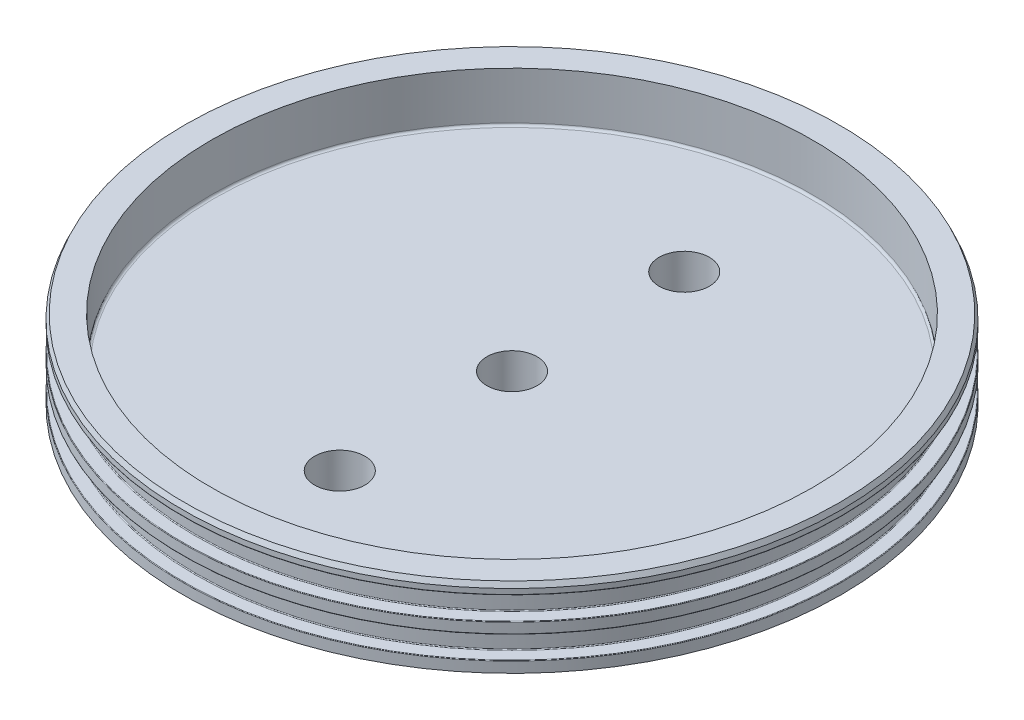
ISO-10303-21;
HEADER;
FILE_DESCRIPTION(('STEP AP214'),'2;1');
FILE_NAME('part.step','',(''),(''),'','','');
FILE_SCHEMA(('AUTOMOTIVE_DESIGN { 1 0 10303 214 1 1 1 1 }'));
ENDSEC;
DATA;
#1=APPLICATION_CONTEXT('core data for automotive mechanical design processes');
#2=APPLICATION_PROTOCOL_DEFINITION('international standard','automotive_design',2000,#1);
#3=PRODUCT_CONTEXT('',#1,'mechanical');
#4=PRODUCT('Part','Part','',(#3));
#5=PRODUCT_RELATED_PRODUCT_CATEGORY('part','',(#4));
#6=PRODUCT_DEFINITION_FORMATION('','',#4);
#7=PRODUCT_DEFINITION_CONTEXT('part definition',#1,'design');
#8=PRODUCT_DEFINITION('design','',#6,#7);
#9=PRODUCT_DEFINITION_SHAPE('','',#8);
#10=(LENGTH_UNIT() NAMED_UNIT(*) SI_UNIT(.MILLI.,.METRE.));
#11=(NAMED_UNIT(*) PLANE_ANGLE_UNIT() SI_UNIT($,.RADIAN.));
#12=(NAMED_UNIT(*) SI_UNIT($,.STERADIAN.) SOLID_ANGLE_UNIT());
#13=UNCERTAINTY_MEASURE_WITH_UNIT(LENGTH_MEASURE(1.E-05),#10,'distance_accuracy_value','');
#14=(GEOMETRIC_REPRESENTATION_CONTEXT(3) GLOBAL_UNCERTAINTY_ASSIGNED_CONTEXT((#13)) GLOBAL_UNIT_ASSIGNED_CONTEXT((#10,
#11,#12)) REPRESENTATION_CONTEXT('',''));
#15=CARTESIAN_POINT('',(0.,0.,0.));
#16=DIRECTION('',(0.,0.,1.));
#17=DIRECTION('',(1.,0.,0.));
#18=AXIS2_PLACEMENT_3D('',#15,#16,#17);
#19=CARTESIAN_POINT('',(0.,0.,0.));
#20=DIRECTION('',(0.,1.,0.));
#21=DIRECTION('',(-1.,0.,0.));
#22=AXIS2_PLACEMENT_3D('',#19,#20,#21);
#23=PLANE('',#22);
#24=CARTESIAN_POINT('',(0.,0.,0.));
#25=DIRECTION('',(0.,1.,0.));
#26=DIRECTION('',(-1.,0.,0.));
#27=AXIS2_PLACEMENT_3D('',#24,#25,#26);
#28=CIRCLE('',#27,66.2178);
#29=CARTESIAN_POINT('',(-66.2178,0.,0.));
#30=VERTEX_POINT('',#29);
#31=EDGE_CURVE('E113',#30,#30,#28,.T.);
#32=ORIENTED_EDGE('',*,*,#31,.T.);
#33=EDGE_LOOP('',(#32));
#34=FACE_BOUND('',#33,.T.);
#35=CARTESIAN_POINT('',(0.,0.,0.));
#36=DIRECTION('',(0.,1.,0.));
#37=DIRECTION('',(-1.,0.,0.));
#38=AXIS2_PLACEMENT_3D('',#35,#36,#37);
#39=CIRCLE('',#38,72.898);
#40=CARTESIAN_POINT('',(-72.898,0.,0.));
#41=VERTEX_POINT('',#40);
#42=EDGE_CURVE('E119',#41,#41,#39,.T.);
#43=ORIENTED_EDGE('',*,*,#42,.F.);
#44=EDGE_LOOP('',(#43));
#45=FACE_BOUND('',#44,.T.);
#46=ADVANCED_FACE('F39',(#34,#45),#23,.F.);
#47=CARTESIAN_POINT('',(0.,48.1922132313012,0.));
#48=DIRECTION('',(0.,1.,0.));
#49=DIRECTION('',(-1.,0.,0.));
#50=AXIS2_PLACEMENT_3D('',#47,#48,#49);
#51=CYLINDRICAL_SURFACE('',#50,72.898);
#52=CARTESIAN_POINT('',(0.,2.33679999999999,0.));
#53=DIRECTION('',(0.,-1.,0.));
#54=DIRECTION('',(1.,0.,0.));
#55=AXIS2_PLACEMENT_3D('',#52,#53,#54);
#56=CIRCLE('',#55,72.898);
#57=CARTESIAN_POINT('',(72.898,2.3368,0.));
#58=VERTEX_POINT('',#57);
#59=EDGE_CURVE('E59',#58,#58,#56,.T.);
#60=ORIENTED_EDGE('',*,*,#59,.T.);
#61=EDGE_LOOP('',(#60));
#62=FACE_BOUND('',#61,.T.);
#63=ORIENTED_EDGE('',*,*,#42,.T.);
#64=EDGE_LOOP('',(#63));
#65=FACE_BOUND('',#64,.T.);
#66=ADVANCED_FACE('F181',(#62,#65),#51,.T.);
#67=CARTESIAN_POINT('',(72.898,2.4638,0.));
#68=DIRECTION('',(0.,-1.,0.));
#69=DIRECTION('',(1.,0.,0.));
#70=AXIS2_PLACEMENT_3D('',#67,#68,#69);
#71=PLANE('',#70);
#72=CARTESIAN_POINT('',(0.,2.46379999999999,0.));
#73=DIRECTION('',(0.,-1.,0.));
#74=DIRECTION('',(1.,0.,0.));
#75=AXIS2_PLACEMENT_3D('',#72,#73,#74);
#76=CIRCLE('',#75,72.771);
#77=CARTESIAN_POINT('',(72.771,2.4638,0.));
#78=VERTEX_POINT('',#77);
#79=EDGE_CURVE('E62',#78,#78,#76,.F.);
#80=ORIENTED_EDGE('',*,*,#79,.T.);
#81=EDGE_LOOP('',(#80));
#82=FACE_BOUND('',#81,.T.);
#83=CARTESIAN_POINT('',(0.,2.46379999999999,0.));
#84=DIRECTION('',(0.,-1.,0.));
#85=DIRECTION('',(1.,0.,0.));
#86=AXIS2_PLACEMENT_3D('',#83,#84,#85);
#87=CIRCLE('',#86,70.1548);
#88=CARTESIAN_POINT('',(70.1548,2.4638,0.));
#89=VERTEX_POINT('',#88);
#90=EDGE_CURVE('E89',#89,#89,#87,.T.);
#91=ORIENTED_EDGE('',*,*,#90,.T.);
#92=EDGE_LOOP('',(#91));
#93=FACE_BOUND('',#92,.T.);
#94=ADVANCED_FACE('F188',(#82,#93),#71,.F.);
#95=CARTESIAN_POINT('',(0.,48.1922132313012,0.));
#96=DIRECTION('',(0.,1.,0.));
#97=DIRECTION('',(-1.,0.,0.));
#98=AXIS2_PLACEMENT_3D('',#95,#96,#97);
#99=CYLINDRICAL_SURFACE('',#98,69.977);
#100=CARTESIAN_POINT('',(0.,7.26439999999999,0.));
#101=DIRECTION('',(0.,1.,0.));
#102=DIRECTION('',(-1.,0.,0.));
#103=AXIS2_PLACEMENT_3D('',#100,#101,#102);
#104=CIRCLE('',#103,69.977);
#105=CARTESIAN_POINT('',(-69.977,7.26439999999998,0.));
#106=VERTEX_POINT('',#105);
#107=EDGE_CURVE('E92',#106,#106,#104,.F.);
#108=ORIENTED_EDGE('',*,*,#107,.T.);
#109=EDGE_LOOP('',(#108));
#110=FACE_BOUND('',#109,.T.);
#111=CARTESIAN_POINT('',(0.,2.64159999999999,0.));
#112=DIRECTION('',(0.,-1.,0.));
#113=DIRECTION('',(1.,0.,0.));
#114=AXIS2_PLACEMENT_3D('',#111,#112,#113);
#115=CIRCLE('',#114,69.977);
#116=CARTESIAN_POINT('',(69.977,2.6416,0.));
#117=VERTEX_POINT('',#116);
#118=EDGE_CURVE('E95',#117,#117,#115,.F.);
#119=ORIENTED_EDGE('',*,*,#118,.T.);
#120=EDGE_LOOP('',(#119));
#121=FACE_BOUND('',#120,.T.);
#122=ADVANCED_FACE('F278',(#110,#121),#99,.T.);
#123=CARTESIAN_POINT('',(69.977,7.4422,0.));
#124=DIRECTION('',(0.,1.,0.));
#125=DIRECTION('',(-1.,0.,0.));
#126=AXIS2_PLACEMENT_3D('',#123,#124,#125);
#127=PLANE('',#126);
#128=CARTESIAN_POINT('',(0.,7.44219999999999,0.));
#129=DIRECTION('',(0.,1.,0.));
#130=DIRECTION('',(-1.,0.,0.));
#131=AXIS2_PLACEMENT_3D('',#128,#129,#130);
#132=CIRCLE('',#131,72.771);
#133=CARTESIAN_POINT('',(-72.771,7.44219999999998,0.));
#134=VERTEX_POINT('',#133);
#135=EDGE_CURVE('E65',#134,#134,#132,.F.);
#136=ORIENTED_EDGE('',*,*,#135,.T.);
#137=EDGE_LOOP('',(#136));
#138=FACE_BOUND('',#137,.T.);
#139=CARTESIAN_POINT('',(0.,7.44219999999999,0.));
#140=DIRECTION('',(0.,1.,0.));
#141=DIRECTION('',(-1.,0.,0.));
#142=AXIS2_PLACEMENT_3D('',#139,#140,#141);
#143=CIRCLE('',#142,70.1548);
#144=CARTESIAN_POINT('',(-70.1548,7.44219999999998,0.));
#145=VERTEX_POINT('',#144);
#146=EDGE_CURVE('E98',#145,#145,#143,.T.);
#147=ORIENTED_EDGE('',*,*,#146,.T.);
#148=EDGE_LOOP('',(#147));
#149=FACE_BOUND('',#148,.T.);
#150=ADVANCED_FACE('F274',(#138,#149),#127,.F.);
#151=CARTESIAN_POINT('',(0.,48.1922132313012,0.));
#152=DIRECTION('',(0.,1.,0.));
#153=DIRECTION('',(-1.,0.,0.));
#154=AXIS2_PLACEMENT_3D('',#151,#152,#153);
#155=CYLINDRICAL_SURFACE('',#154,72.898);
#156=CARTESIAN_POINT('',(0.,9.77899999999999,0.));
#157=DIRECTION('',(0.,-1.,0.));
#158=DIRECTION('',(1.,0.,0.));
#159=AXIS2_PLACEMENT_3D('',#156,#157,#158);
#160=CIRCLE('',#159,72.898);
#161=CARTESIAN_POINT('',(72.898,9.779,0.));
#162=VERTEX_POINT('',#161);
#163=EDGE_CURVE('E68',#162,#162,#160,.T.);
#164=ORIENTED_EDGE('',*,*,#163,.T.);
#165=EDGE_LOOP('',(#164));
#166=FACE_BOUND('',#165,.T.);
#167=CARTESIAN_POINT('',(0.,7.56919999999999,0.));
#168=DIRECTION('',(0.,1.,0.));
#169=DIRECTION('',(-1.,0.,0.));
#170=AXIS2_PLACEMENT_3D('',#167,#168,#169);
#171=CIRCLE('',#170,72.898);
#172=CARTESIAN_POINT('',(-72.898,7.56919999999998,0.));
#173=VERTEX_POINT('',#172);
#174=EDGE_CURVE('E71',#173,#173,#171,.T.);
#175=ORIENTED_EDGE('',*,*,#174,.T.);
#176=EDGE_LOOP('',(#175));
#177=FACE_BOUND('',#176,.T.);
#178=ADVANCED_FACE('F270',(#166,#177),#155,.T.);
#179=CARTESIAN_POINT('',(72.898,9.906,0.));
#180=DIRECTION('',(0.,-1.,0.));
#181=DIRECTION('',(1.,0.,0.));
#182=AXIS2_PLACEMENT_3D('',#179,#180,#181);
#183=PLANE('',#182);
#184=CARTESIAN_POINT('',(0.,9.90599999999999,0.));
#185=DIRECTION('',(0.,-1.,0.));
#186=DIRECTION('',(1.,0.,0.));
#187=AXIS2_PLACEMENT_3D('',#184,#185,#186);
#188=CIRCLE('',#187,72.771);
#189=CARTESIAN_POINT('',(72.771,9.906,0.));
#190=VERTEX_POINT('',#189);
#191=EDGE_CURVE('E74',#190,#190,#188,.F.);
#192=ORIENTED_EDGE('',*,*,#191,.T.);
#193=EDGE_LOOP('',(#192));
#194=FACE_BOUND('',#193,.T.);
#195=CARTESIAN_POINT('',(0.,9.90599999999999,0.));
#196=DIRECTION('',(0.,-1.,0.));
#197=DIRECTION('',(1.,0.,0.));
#198=AXIS2_PLACEMENT_3D('',#195,#196,#197);
#199=CIRCLE('',#198,70.1548);
#200=CARTESIAN_POINT('',(70.1548,9.906,0.));
#201=VERTEX_POINT('',#200);
#202=EDGE_CURVE('E101',#201,#201,#199,.T.);
#203=ORIENTED_EDGE('',*,*,#202,.T.);
#204=EDGE_LOOP('',(#203));
#205=FACE_BOUND('',#204,.T.);
#206=ADVANCED_FACE('F266',(#194,#205),#183,.F.);
#207=CARTESIAN_POINT('',(0.,48.1922132313012,0.));
#208=DIRECTION('',(0.,1.,0.));
#209=DIRECTION('',(-1.,0.,0.));
#210=AXIS2_PLACEMENT_3D('',#207,#208,#209);
#211=CYLINDRICAL_SURFACE('',#210,69.977);
#212=CARTESIAN_POINT('',(0.,14.8082,0.));
#213=DIRECTION('',(0.,1.,0.));
#214=DIRECTION('',(-1.,0.,0.));
#215=AXIS2_PLACEMENT_3D('',#212,#213,#214);
#216=CIRCLE('',#215,69.977);
#217=CARTESIAN_POINT('',(-69.977,14.8082,0.));
#218=VERTEX_POINT('',#217);
#219=EDGE_CURVE('E104',#218,#218,#216,.F.);
#220=ORIENTED_EDGE('',*,*,#219,.T.);
#221=EDGE_LOOP('',(#220));
#222=FACE_BOUND('',#221,.T.);
#223=CARTESIAN_POINT('',(0.,10.0838,0.));
#224=DIRECTION('',(0.,-1.,0.));
#225=DIRECTION('',(1.,0.,0.));
#226=AXIS2_PLACEMENT_3D('',#223,#224,#225);
#227=CIRCLE('',#226,69.977);
#228=CARTESIAN_POINT('',(69.977,10.0838,0.));
#229=VERTEX_POINT('',#228);
#230=EDGE_CURVE('E107',#229,#229,#227,.F.);
#231=ORIENTED_EDGE('',*,*,#230,.T.);
#232=EDGE_LOOP('',(#231));
#233=FACE_BOUND('',#232,.T.);
#234=ADVANCED_FACE('F262',(#222,#233),#211,.T.);
#235=CARTESIAN_POINT('',(69.977,14.986,0.));
#236=DIRECTION('',(0.,1.,0.));
#237=DIRECTION('',(-1.,0.,0.));
#238=AXIS2_PLACEMENT_3D('',#235,#236,#237);
#239=PLANE('',#238);
#240=CARTESIAN_POINT('',(0.,14.986,0.));
#241=DIRECTION('',(0.,1.,0.));
#242=DIRECTION('',(-1.,0.,0.));
#243=AXIS2_PLACEMENT_3D('',#240,#241,#242);
#244=CIRCLE('',#243,72.771);
#245=CARTESIAN_POINT('',(-72.771,14.986,0.));
#246=VERTEX_POINT('',#245);
#247=EDGE_CURVE('E77',#246,#246,#244,.F.);
#248=ORIENTED_EDGE('',*,*,#247,.T.);
#249=EDGE_LOOP('',(#248));
#250=FACE_BOUND('',#249,.T.);
#251=CARTESIAN_POINT('',(0.,14.986,0.));
#252=DIRECTION('',(0.,1.,0.));
#253=DIRECTION('',(-1.,0.,0.));
#254=AXIS2_PLACEMENT_3D('',#251,#252,#253);
#255=CIRCLE('',#254,70.1548);
#256=CARTESIAN_POINT('',(-70.1548,14.986,0.));
#257=VERTEX_POINT('',#256);
#258=EDGE_CURVE('E110',#257,#257,#255,.T.);
#259=ORIENTED_EDGE('',*,*,#258,.T.);
#260=EDGE_LOOP('',(#259));
#261=FACE_BOUND('',#260,.T.);
#262=ADVANCED_FACE('F256',(#250,#261),#239,.F.);
#263=CARTESIAN_POINT('',(0.,48.1922132313012,0.));
#264=DIRECTION('',(0.,1.,0.));
#265=DIRECTION('',(-1.,0.,0.));
#266=AXIS2_PLACEMENT_3D('',#263,#264,#265);
#267=CYLINDRICAL_SURFACE('',#266,72.898);
#268=CARTESIAN_POINT('',(0.,16.2587904843811,0.));
#269=DIRECTION('',(0.,-1.,0.));
#270=DIRECTION('',(1.,0.,0.));
#271=AXIS2_PLACEMENT_3D('',#268,#269,#270);
#272=CIRCLE('',#271,72.898);
#273=CARTESIAN_POINT('',(72.898,16.2587904843811,0.));
#274=VERTEX_POINT('',#273);
#275=EDGE_CURVE('E50',#274,#274,#272,.T.);
#276=ORIENTED_EDGE('',*,*,#275,.T.);
#277=EDGE_LOOP('',(#276));
#278=FACE_BOUND('',#277,.T.);
#279=CARTESIAN_POINT('',(0.,15.113,0.));
#280=DIRECTION('',(0.,1.,0.));
#281=DIRECTION('',(-1.,0.,0.));
#282=AXIS2_PLACEMENT_3D('',#279,#280,#281);
#283=CIRCLE('',#282,72.898);
#284=CARTESIAN_POINT('',(-72.898,15.113,0.));
#285=VERTEX_POINT('',#284);
#286=EDGE_CURVE('E80',#285,#285,#283,.T.);
#287=ORIENTED_EDGE('',*,*,#286,.T.);
#288=EDGE_LOOP('',(#287));
#289=FACE_BOUND('',#288,.T.);
#290=ADVANCED_FACE('F249',(#278,#289),#267,.T.);
#291=CARTESIAN_POINT('',(72.898,17.3482,0.));
#292=DIRECTION('',(0.,-1.,0.));
#293=DIRECTION('',(1.,0.,0.));
#294=AXIS2_PLACEMENT_3D('',#291,#292,#293);
#295=PLANE('',#294);
#296=CARTESIAN_POINT('',(0.,17.3482,0.));
#297=DIRECTION('',(0.,-1.,0.));
#298=DIRECTION('',(1.,0.,0.));
#299=AXIS2_PLACEMENT_3D('',#296,#297,#298);
#300=CIRCLE('',#299,72.39);
#301=CARTESIAN_POINT('',(72.39,17.3482,0.));
#302=VERTEX_POINT('',#301);
#303=EDGE_CURVE('E54',#302,#302,#300,.F.);
#304=ORIENTED_EDGE('',*,*,#303,.T.);
#305=EDGE_LOOP('',(#304));
#306=FACE_BOUND('',#305,.T.);
#307=CARTESIAN_POINT('',(0.,17.3482,0.));
#308=DIRECTION('',(0.,1.,0.));
#309=DIRECTION('',(-1.,0.,0.));
#310=AXIS2_PLACEMENT_3D('',#307,#308,#309);
#311=CIRCLE('',#310,66.548);
#312=CARTESIAN_POINT('',(-66.548,17.3482,0.));
#313=VERTEX_POINT('',#312);
#314=EDGE_CURVE('E122',#313,#313,#311,.T.);
#315=ORIENTED_EDGE('',*,*,#314,.F.);
#316=EDGE_LOOP('',(#315));
#317=FACE_BOUND('',#316,.T.);
#318=ADVANCED_FACE('F177',(#306,#317),#295,.F.);
#319=CARTESIAN_POINT('',(0.,48.1922132313012,0.));
#320=DIRECTION('',(0.,1.,0.));
#321=DIRECTION('',(-1.,0.,0.));
#322=AXIS2_PLACEMENT_3D('',#319,#320,#321);
#323=CYLINDRICAL_SURFACE('',#322,66.548);
#324=CARTESIAN_POINT('',(0.,6.858,0.));
#325=DIRECTION('',(0.,-1.,0.));
#326=DIRECTION('',(1.,0.,0.));
#327=AXIS2_PLACEMENT_3D('',#324,#325,#326);
#328=CIRCLE('',#327,66.548);
#329=CARTESIAN_POINT('',(66.548,6.858,0.));
#330=VERTEX_POINT('',#329);
#331=EDGE_CURVE('E10',#330,#330,#328,.T.);
#332=ORIENTED_EDGE('',*,*,#331,.T.);
#333=EDGE_LOOP('',(#332));
#334=FACE_BOUND('',#333,.T.);
#335=ORIENTED_EDGE('',*,*,#314,.T.);
#336=EDGE_LOOP('',(#335));
#337=FACE_BOUND('',#336,.T.);
#338=ADVANCED_FACE('F167',(#334,#337),#323,.F.);
#339=CARTESIAN_POINT('',(66.548,6.35,0.));
#340=DIRECTION('',(0.,-1.,0.));
#341=DIRECTION('',(1.,0.,0.));
#342=AXIS2_PLACEMENT_3D('',#339,#340,#341);
#343=PLANE('',#342);
#344=CARTESIAN_POINT('',(0.,6.34999999999999,38.1));
#345=DIRECTION('',(0.,-1.,0.));
#346=DIRECTION('',(1.,0.,0.));
#347=AXIS2_PLACEMENT_3D('',#344,#345,#346);
#348=CIRCLE('',#347,5.56259999999999);
#349=CARTESIAN_POINT('',(5.56259999999999,6.35,38.1));
#350=VERTEX_POINT('',#349);
#351=EDGE_CURVE('E137',#350,#350,#348,.T.);
#352=ORIENTED_EDGE('',*,*,#351,.T.);
#353=EDGE_LOOP('',(#352));
#354=FACE_BOUND('',#353,.T.);
#355=CARTESIAN_POINT('',(0.,6.34999999999999,-38.1));
#356=DIRECTION('',(0.,-1.,0.));
#357=DIRECTION('',(1.,0.,0.));
#358=AXIS2_PLACEMENT_3D('',#355,#356,#357);
#359=CIRCLE('',#358,5.5626);
#360=CARTESIAN_POINT('',(5.5626,6.35,-38.1));
#361=VERTEX_POINT('',#360);
#362=EDGE_CURVE('E131',#361,#361,#359,.T.);
#363=ORIENTED_EDGE('',*,*,#362,.T.);
#364=EDGE_LOOP('',(#363));
#365=FACE_BOUND('',#364,.T.);
#366=CARTESIAN_POINT('',(0.,6.35,0.));
#367=DIRECTION('',(0.,-1.,0.));
#368=DIRECTION('',(1.,0.,0.));
#369=AXIS2_PLACEMENT_3D('',#366,#367,#368);
#370=CIRCLE('',#369,66.04);
#371=CARTESIAN_POINT('',(66.04,6.35,0.));
#372=VERTEX_POINT('',#371);
#373=EDGE_CURVE('E46',#372,#372,#370,.F.);
#374=ORIENTED_EDGE('',*,*,#373,.T.);
#375=EDGE_LOOP('',(#374));
#376=FACE_BOUND('',#375,.T.);
#377=CARTESIAN_POINT('',(0.,6.35,0.));
#378=DIRECTION('',(0.,1.,0.));
#379=DIRECTION('',(0.,0.,1.));
#380=AXIS2_PLACEMENT_3D('',#377,#378,#379);
#381=CIRCLE('',#380,5.56259999999999);
#382=CARTESIAN_POINT('',(0.,6.35,5.56259999999999));
#383=VERTEX_POINT('',#382);
#384=EDGE_CURVE('E128',#383,#383,#381,.T.);
#385=ORIENTED_EDGE('',*,*,#384,.F.);
#386=EDGE_LOOP('',(#385));
#387=FACE_BOUND('',#386,.T.);
#388=ADVANCED_FACE('F165',(#354,#365,#376,#387),#343,.F.);
#389=CARTESIAN_POINT('',(0.,-2.54,0.));
#390=DIRECTION('',(0.,1.,0.));
#391=DIRECTION('',(-1.,0.,0.));
#392=AXIS2_PLACEMENT_3D('',#389,#390,#391);
#393=CYLINDRICAL_SURFACE('',#392,66.04);
#394=CARTESIAN_POINT('',(0.,-2.413,0.));
#395=DIRECTION('',(0.,-1.,0.));
#396=DIRECTION('',(1.,0.,0.));
#397=AXIS2_PLACEMENT_3D('',#394,#395,#396);
#398=CIRCLE('',#397,66.04);
#399=CARTESIAN_POINT('',(66.04,-2.41299999999999,0.));
#400=VERTEX_POINT('',#399);
#401=EDGE_CURVE('E83',#400,#400,#398,.F.);
#402=ORIENTED_EDGE('',*,*,#401,.T.);
#403=EDGE_LOOP('',(#402));
#404=FACE_BOUND('',#403,.T.);
#405=CARTESIAN_POINT('',(0.,-0.177800000000004,0.));
#406=DIRECTION('',(0.,1.,0.));
#407=DIRECTION('',(-1.,0.,0.));
#408=AXIS2_PLACEMENT_3D('',#405,#406,#407);
#409=CIRCLE('',#408,66.04);
#410=CARTESIAN_POINT('',(-66.04,-0.177800000000012,0.));
#411=VERTEX_POINT('',#410);
#412=EDGE_CURVE('E116',#411,#411,#409,.F.);
#413=ORIENTED_EDGE('',*,*,#412,.T.);
#414=EDGE_LOOP('',(#413));
#415=FACE_BOUND('',#414,.T.);
#416=ADVANCED_FACE('F151',(#404,#415),#393,.T.);
#417=CARTESIAN_POINT('',(0.,-2.54,0.));
#418=DIRECTION('',(0.,-1.,0.));
#419=DIRECTION('',(1.,0.,0.));
#420=AXIS2_PLACEMENT_3D('',#417,#418,#419);
#421=PLANE('',#420);
#422=CARTESIAN_POINT('',(0.,-2.54,38.1));
#423=DIRECTION('',(0.,-1.,0.));
#424=DIRECTION('',(0.,0.,-1.));
#425=AXIS2_PLACEMENT_3D('',#422,#423,#424);
#426=CIRCLE('',#425,5.56259999999999);
#427=CARTESIAN_POINT('',(0.,-2.54,32.5374));
#428=VERTEX_POINT('',#427);
#429=EDGE_CURVE('E140',#428,#428,#426,.T.);
#430=ORIENTED_EDGE('',*,*,#429,.F.);
#431=EDGE_LOOP('',(#430));
#432=FACE_BOUND('',#431,.T.);
#433=CARTESIAN_POINT('',(0.,-2.54,-38.1));
#434=DIRECTION('',(0.,-1.,0.));
#435=DIRECTION('',(0.,0.,-1.));
#436=AXIS2_PLACEMENT_3D('',#433,#434,#435);
#437=CIRCLE('',#436,5.5626);
#438=CARTESIAN_POINT('',(0.,-2.54,-43.6626));
#439=VERTEX_POINT('',#438);
#440=EDGE_CURVE('E134',#439,#439,#437,.T.);
#441=ORIENTED_EDGE('',*,*,#440,.F.);
#442=EDGE_LOOP('',(#441));
#443=FACE_BOUND('',#442,.T.);
#444=CARTESIAN_POINT('',(0.,-2.54,0.));
#445=DIRECTION('',(0.,-1.,0.));
#446=DIRECTION('',(1.,0.,0.));
#447=AXIS2_PLACEMENT_3D('',#444,#445,#446);
#448=CIRCLE('',#447,65.913);
#449=CARTESIAN_POINT('',(65.913,-2.53999999999999,0.));
#450=VERTEX_POINT('',#449);
#451=EDGE_CURVE('E86',#450,#450,#448,.T.);
#452=ORIENTED_EDGE('',*,*,#451,.T.);
#453=EDGE_LOOP('',(#452));
#454=FACE_BOUND('',#453,.T.);
#455=CARTESIAN_POINT('',(0.,-2.54,0.));
#456=DIRECTION('',(0.,1.,0.));
#457=DIRECTION('',(0.,0.,1.));
#458=AXIS2_PLACEMENT_3D('',#455,#456,#457);
#459=CIRCLE('',#458,5.5626);
#460=CARTESIAN_POINT('',(0.,-2.54,5.5626));
#461=VERTEX_POINT('',#460);
#462=EDGE_CURVE('E125',#461,#461,#459,.T.);
#463=ORIENTED_EDGE('',*,*,#462,.T.);
#464=EDGE_LOOP('',(#463));
#465=FACE_BOUND('',#464,.T.);
#466=ADVANCED_FACE('F147',(#432,#443,#454,#465),#421,.T.);
#467=CARTESIAN_POINT('',(0.,6.35,0.));
#468=DIRECTION('',(0.,1.,0.));
#469=DIRECTION('',(0.,0.,1.));
#470=AXIS2_PLACEMENT_3D('',#467,#468,#469);
#471=CYLINDRICAL_SURFACE('',#470,5.56259999999999);
#472=ORIENTED_EDGE('',*,*,#462,.F.);
#473=EDGE_LOOP('',(#472));
#474=FACE_BOUND('',#473,.T.);
#475=ORIENTED_EDGE('',*,*,#384,.T.);
#476=EDGE_LOOP('',(#475));
#477=FACE_BOUND('',#476,.T.);
#478=ADVANCED_FACE('F150',(#474,#477),#471,.F.);
#479=CARTESIAN_POINT('',(0.,-0.177800000000004,0.));
#480=DIRECTION('',(0.,1.,0.));
#481=DIRECTION('',(-1.,0.,0.));
#482=AXIS2_PLACEMENT_3D('',#479,#480,#481);
#483=TOROIDAL_SURFACE('',#482,66.2178,0.1778);
#484=ORIENTED_EDGE('',*,*,#31,.F.);
#485=EDGE_LOOP('',(#484));
#486=FACE_BOUND('',#485,.T.);
#487=ORIENTED_EDGE('',*,*,#412,.F.);
#488=EDGE_LOOP('',(#487));
#489=FACE_BOUND('',#488,.T.);
#490=ADVANCED_FACE('F161',(#486,#489),#483,.F.);
#491=CARTESIAN_POINT('',(0.,14.8082,0.));
#492=DIRECTION('',(0.,1.,0.));
#493=DIRECTION('',(-1.,0.,0.));
#494=AXIS2_PLACEMENT_3D('',#491,#492,#493);
#495=TOROIDAL_SURFACE('',#494,70.1548,0.1778);
#496=ORIENTED_EDGE('',*,*,#219,.F.);
#497=EDGE_LOOP('',(#496));
#498=FACE_BOUND('',#497,.T.);
#499=ORIENTED_EDGE('',*,*,#258,.F.);
#500=EDGE_LOOP('',(#499));
#501=FACE_BOUND('',#500,.T.);
#502=ADVANCED_FACE('F196',(#498,#501),#495,.F.);
#503=CARTESIAN_POINT('',(0.,10.0838,0.));
#504=DIRECTION('',(0.,-1.,0.));
#505=DIRECTION('',(1.,0.,0.));
#506=AXIS2_PLACEMENT_3D('',#503,#504,#505);
#507=TOROIDAL_SURFACE('',#506,70.1548,0.1778);
#508=ORIENTED_EDGE('',*,*,#202,.F.);
#509=EDGE_LOOP('',(#508));
#510=FACE_BOUND('',#509,.T.);
#511=ORIENTED_EDGE('',*,*,#230,.F.);
#512=EDGE_LOOP('',(#511));
#513=FACE_BOUND('',#512,.T.);
#514=ADVANCED_FACE('F200',(#510,#513),#507,.F.);
#515=CARTESIAN_POINT('',(0.,7.26439999999999,0.));
#516=DIRECTION('',(0.,1.,0.));
#517=DIRECTION('',(-1.,0.,0.));
#518=AXIS2_PLACEMENT_3D('',#515,#516,#517);
#519=TOROIDAL_SURFACE('',#518,70.1548,0.1778);
#520=ORIENTED_EDGE('',*,*,#107,.F.);
#521=EDGE_LOOP('',(#520));
#522=FACE_BOUND('',#521,.T.);
#523=ORIENTED_EDGE('',*,*,#146,.F.);
#524=EDGE_LOOP('',(#523));
#525=FACE_BOUND('',#524,.T.);
#526=ADVANCED_FACE('F204',(#522,#525),#519,.F.);
#527=CARTESIAN_POINT('',(0.,2.64159999999999,0.));
#528=DIRECTION('',(0.,-1.,0.));
#529=DIRECTION('',(1.,0.,0.));
#530=AXIS2_PLACEMENT_3D('',#527,#528,#529);
#531=TOROIDAL_SURFACE('',#530,70.1548,0.1778);
#532=ORIENTED_EDGE('',*,*,#90,.F.);
#533=EDGE_LOOP('',(#532));
#534=FACE_BOUND('',#533,.T.);
#535=ORIENTED_EDGE('',*,*,#118,.F.);
#536=EDGE_LOOP('',(#535));
#537=FACE_BOUND('',#536,.T.);
#538=ADVANCED_FACE('F208',(#534,#537),#531,.F.);
#539=CARTESIAN_POINT('',(0.,-2.413,0.));
#540=DIRECTION('',(0.,-1.,0.));
#541=DIRECTION('',(1.,0.,0.));
#542=AXIS2_PLACEMENT_3D('',#539,#540,#541);
#543=TOROIDAL_SURFACE('',#542,65.913,0.127);
#544=ORIENTED_EDGE('',*,*,#401,.F.);
#545=EDGE_LOOP('',(#544));
#546=FACE_BOUND('',#545,.T.);
#547=ORIENTED_EDGE('',*,*,#451,.F.);
#548=EDGE_LOOP('',(#547));
#549=FACE_BOUND('',#548,.T.);
#550=ADVANCED_FACE('F212',(#546,#549),#543,.T.);
#551=CARTESIAN_POINT('',(0.,15.113,0.));
#552=DIRECTION('',(0.,1.,0.));
#553=DIRECTION('',(-1.,0.,0.));
#554=AXIS2_PLACEMENT_3D('',#551,#552,#553);
#555=TOROIDAL_SURFACE('',#554,72.771,0.127);
#556=ORIENTED_EDGE('',*,*,#247,.F.);
#557=EDGE_LOOP('',(#556));
#558=FACE_BOUND('',#557,.T.);
#559=ORIENTED_EDGE('',*,*,#286,.F.);
#560=EDGE_LOOP('',(#559));
#561=FACE_BOUND('',#560,.T.);
#562=ADVANCED_FACE('F216',(#558,#561),#555,.T.);
#563=CARTESIAN_POINT('',(0.,9.77899999999999,0.));
#564=DIRECTION('',(0.,-1.,0.));
#565=DIRECTION('',(1.,0.,0.));
#566=AXIS2_PLACEMENT_3D('',#563,#564,#565);
#567=TOROIDAL_SURFACE('',#566,72.771,0.127);
#568=ORIENTED_EDGE('',*,*,#163,.F.);
#569=EDGE_LOOP('',(#568));
#570=FACE_BOUND('',#569,.T.);
#571=ORIENTED_EDGE('',*,*,#191,.F.);
#572=EDGE_LOOP('',(#571));
#573=FACE_BOUND('',#572,.T.);
#574=ADVANCED_FACE('F220',(#570,#573),#567,.T.);
#575=CARTESIAN_POINT('',(0.,7.56919999999999,0.));
#576=DIRECTION('',(0.,1.,0.));
#577=DIRECTION('',(-1.,0.,0.));
#578=AXIS2_PLACEMENT_3D('',#575,#576,#577);
#579=TOROIDAL_SURFACE('',#578,72.771,0.127);
#580=ORIENTED_EDGE('',*,*,#135,.F.);
#581=EDGE_LOOP('',(#580));
#582=FACE_BOUND('',#581,.T.);
#583=ORIENTED_EDGE('',*,*,#174,.F.);
#584=EDGE_LOOP('',(#583));
#585=FACE_BOUND('',#584,.T.);
#586=ADVANCED_FACE('F224',(#582,#585),#579,.T.);
#587=CARTESIAN_POINT('',(0.,2.33679999999999,0.));
#588=DIRECTION('',(0.,-1.,0.));
#589=DIRECTION('',(1.,0.,0.));
#590=AXIS2_PLACEMENT_3D('',#587,#588,#589);
#591=TOROIDAL_SURFACE('',#590,72.771,0.127);
#592=ORIENTED_EDGE('',*,*,#59,.F.);
#593=EDGE_LOOP('',(#592));
#594=FACE_BOUND('',#593,.T.);
#595=ORIENTED_EDGE('',*,*,#79,.F.);
#596=EDGE_LOOP('',(#595));
#597=FACE_BOUND('',#596,.T.);
#598=ADVANCED_FACE('F228',(#594,#597),#591,.T.);
#599=CARTESIAN_POINT('',(0.,17.3482,0.));
#600=DIRECTION('',(0.,-1.,0.));
#601=DIRECTION('',(1.,0.,0.));
#602=AXIS2_PLACEMENT_3D('',#599,#600,#601);
#603=CONICAL_SURFACE('',#602,72.39,0.436332312998586);
#604=ORIENTED_EDGE('',*,*,#275,.F.);
#605=EDGE_LOOP('',(#604));
#606=FACE_BOUND('',#605,.T.);
#607=ORIENTED_EDGE('',*,*,#303,.F.);
#608=EDGE_LOOP('',(#607));
#609=FACE_BOUND('',#608,.T.);
#610=ADVANCED_FACE('F231',(#606,#609),#603,.T.);
#611=CARTESIAN_POINT('',(0.,6.858,0.));
#612=DIRECTION('',(0.,-1.,0.));
#613=DIRECTION('',(1.,0.,0.));
#614=AXIS2_PLACEMENT_3D('',#611,#612,#613);
#615=TOROIDAL_SURFACE('',#614,66.04,0.508);
#616=ORIENTED_EDGE('',*,*,#331,.F.);
#617=EDGE_LOOP('',(#616));
#618=FACE_BOUND('',#617,.T.);
#619=ORIENTED_EDGE('',*,*,#373,.F.);
#620=EDGE_LOOP('',(#619));
#621=FACE_BOUND('',#620,.T.);
#622=ADVANCED_FACE('F41',(#618,#621),#615,.F.);
#623=CARTESIAN_POINT('',(0.,-2.54,-38.1));
#624=DIRECTION('',(0.,-1.,0.));
#625=DIRECTION('',(0.,0.,-1.));
#626=AXIS2_PLACEMENT_3D('',#623,#624,#625);
#627=CYLINDRICAL_SURFACE('',#626,5.5626);
#628=ORIENTED_EDGE('',*,*,#440,.T.);
#629=EDGE_LOOP('',(#628));
#630=FACE_BOUND('',#629,.T.);
#631=ORIENTED_EDGE('',*,*,#362,.F.);
#632=EDGE_LOOP('',(#631));
#633=FACE_BOUND('',#632,.T.);
#634=ADVANCED_FACE('F242',(#630,#633),#627,.F.);
#635=CARTESIAN_POINT('',(0.,-2.54,38.1));
#636=DIRECTION('',(0.,-1.,0.));
#637=DIRECTION('',(0.,0.,-1.));
#638=AXIS2_PLACEMENT_3D('',#635,#636,#637);
#639=CYLINDRICAL_SURFACE('',#638,5.56259999999999);
#640=ORIENTED_EDGE('',*,*,#429,.T.);
#641=EDGE_LOOP('',(#640));
#642=FACE_BOUND('',#641,.T.);
#643=ORIENTED_EDGE('',*,*,#351,.F.);
#644=EDGE_LOOP('',(#643));
#645=FACE_BOUND('',#644,.T.);
#646=ADVANCED_FACE('F144',(#642,#645),#639,.F.);
#647=CLOSED_SHELL('',(#46,#66,#94,#122,#150,#178,#206,#234,#262,#290,#318,#338,#388,#416,#466,
#478,#490,#502,#514,#526,#538,#550,#562,#574,#586,#598,#610,#622,#634,#646));
#648=MANIFOLD_SOLID_BREP('B2',#647);
#649=ADVANCED_BREP_SHAPE_REPRESENTATION('',(#18,#648),#14);
#650=SHAPE_DEFINITION_REPRESENTATION(#9,#649);
ENDSEC;
END-ISO-10303-21;
